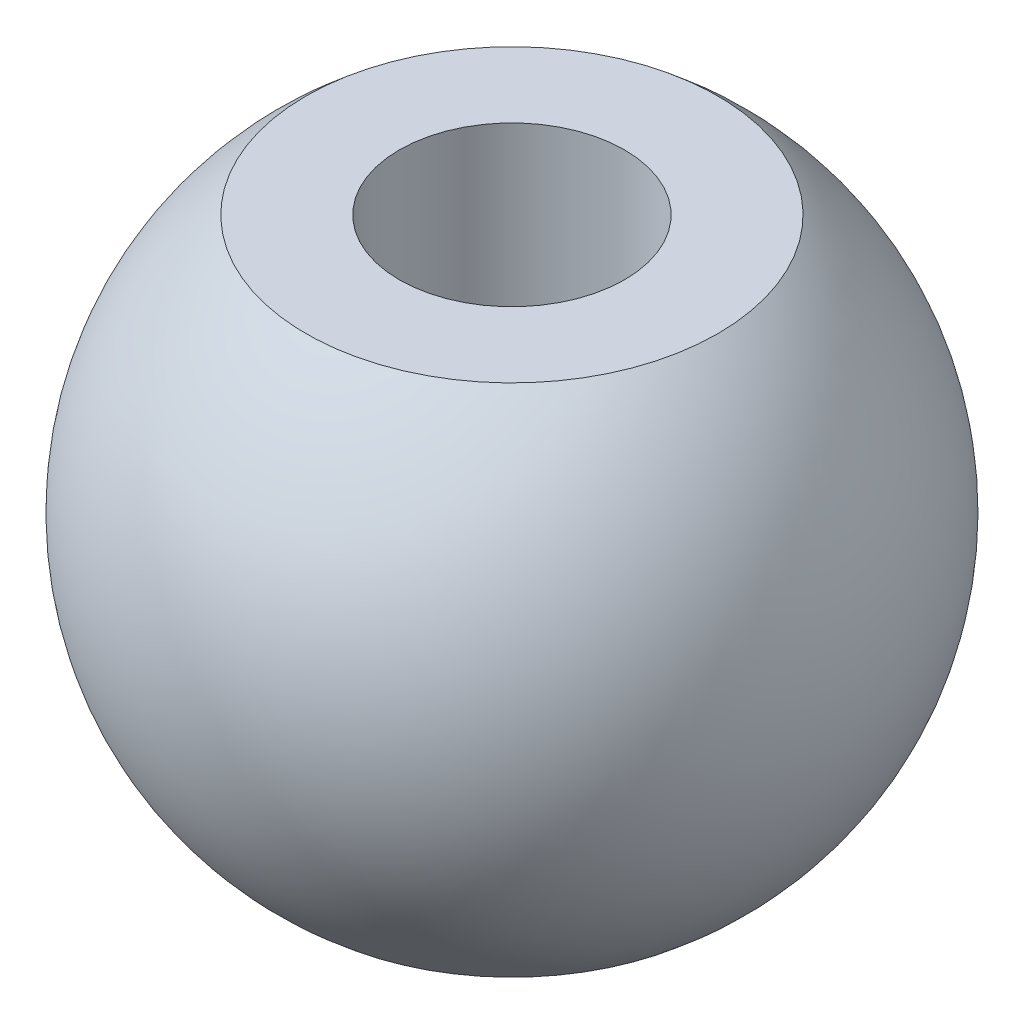
ISO-10303-21;
HEADER;
FILE_DESCRIPTION(('STEP AP214'),'2;1');
FILE_NAME('part.step','',(''),(''),'','','');
FILE_SCHEMA(('AUTOMOTIVE_DESIGN { 1 0 10303 214 1 1 1 1 }'));
ENDSEC;
DATA;
#1=APPLICATION_CONTEXT('core data for automotive mechanical design processes');
#2=APPLICATION_PROTOCOL_DEFINITION('international standard','automotive_design',2000,#1);
#3=PRODUCT_CONTEXT('',#1,'mechanical');
#4=PRODUCT('Part','Part','',(#3));
#5=PRODUCT_RELATED_PRODUCT_CATEGORY('part','',(#4));
#6=PRODUCT_DEFINITION_FORMATION('','',#4);
#7=PRODUCT_DEFINITION_CONTEXT('part definition',#1,'design');
#8=PRODUCT_DEFINITION('design','',#6,#7);
#9=PRODUCT_DEFINITION_SHAPE('','',#8);
#10=(LENGTH_UNIT() NAMED_UNIT(*) SI_UNIT(.MILLI.,.METRE.));
#11=(NAMED_UNIT(*) PLANE_ANGLE_UNIT() SI_UNIT($,.RADIAN.));
#12=(NAMED_UNIT(*) SI_UNIT($,.STERADIAN.) SOLID_ANGLE_UNIT());
#13=UNCERTAINTY_MEASURE_WITH_UNIT(LENGTH_MEASURE(1.E-05),#10,'distance_accuracy_value','');
#14=(GEOMETRIC_REPRESENTATION_CONTEXT(3) GLOBAL_UNCERTAINTY_ASSIGNED_CONTEXT((#13)) GLOBAL_UNIT_ASSIGNED_CONTEXT((#10,
#11,#12)) REPRESENTATION_CONTEXT('',''));
#15=CARTESIAN_POINT('',(0.,0.,0.));
#16=DIRECTION('',(0.,0.,1.));
#17=DIRECTION('',(1.,0.,0.));
#18=AXIS2_PLACEMENT_3D('',#15,#16,#17);
#19=CARTESIAN_POINT('',(0.,4.,0.));
#20=DIRECTION('',(0.,1.,0.));
#21=DIRECTION('',(0.,0.,1.));
#22=AXIS2_PLACEMENT_3D('',#19,#20,#21);
#23=PLANE('',#22);
#24=CARTESIAN_POINT('',(0.,4.,0.));
#25=DIRECTION('',(0.,1.,0.));
#26=DIRECTION('',(0.,0.,1.));
#27=AXIS2_PLACEMENT_3D('',#24,#25,#26);
#28=CIRCLE('',#27,1.75);
#29=CARTESIAN_POINT('',(0.,4.,1.75));
#30=VERTEX_POINT('',#29);
#31=EDGE_CURVE('E51',#30,#30,#28,.T.);
#32=ORIENTED_EDGE('',*,*,#31,.F.);
#33=EDGE_LOOP('',(#32));
#34=FACE_BOUND('',#33,.T.);
#35=CARTESIAN_POINT('',(0.,4.,0.));
#36=DIRECTION('',(0.,1.,0.));
#37=DIRECTION('',(0.,0.,1.));
#38=AXIS2_PLACEMENT_3D('',#35,#36,#37);
#39=CIRCLE('',#38,3.2);
#40=CARTESIAN_POINT('',(-3.2,4.,0.));
#41=VERTEX_POINT('',#40);
#42=EDGE_CURVE('E10',#41,#41,#39,.T.);
#43=ORIENTED_EDGE('',*,*,#42,.T.);
#44=EDGE_LOOP('',(#43));
#45=FACE_BOUND('',#44,.T.);
#46=ADVANCED_FACE('F40',(#34,#45),#23,.T.);
#47=CARTESIAN_POINT('',(0.,0.,0.));
#48=DIRECTION('',(0.,1.,0.));
#49=DIRECTION('',(-1.,0.,0.));
#50=AXIS2_PLACEMENT_3D('',#47,#48,#49);
#51=SPHERICAL_SURFACE('',#50,5.12249938994628);
#52=CARTESIAN_POINT('',(0.,-4.,0.));
#53=DIRECTION('',(0.,1.,0.));
#54=DIRECTION('',(0.,0.,1.));
#55=AXIS2_PLACEMENT_3D('',#52,#53,#54);
#56=CIRCLE('',#55,3.2);
#57=CARTESIAN_POINT('',(-3.2,-4.,0.));
#58=VERTEX_POINT('',#57);
#59=EDGE_CURVE('E43',#58,#58,#56,.T.);
#60=CARTESIAN_POINT('',(-3.2,-4.,0.));
#61=CARTESIAN_POINT('',(-3.274673290891,-3.94026522354734,0.));
#62=CARTESIAN_POINT('',(-3.3476699179412,-3.87843508535872,0.));
#63=CARTESIAN_POINT('',(-3.49008979523146,-3.75078781772341,0.));
#64=CARTESIAN_POINT('',(-3.55951304547154,-3.68497068827673,0.));
#65=CARTESIAN_POINT('',(-3.69456612001304,-3.54955317033917,0.));
#66=CARTESIAN_POINT('',(-3.76019594431448,-3.47995278184829,0.));
#67=CARTESIAN_POINT('',(-3.8874570146498,-3.33718769046449,0.));
#68=CARTESIAN_POINT('',(-3.94908826068369,-3.26402298757157,0.));
#69=CARTESIAN_POINT('',(-4.06815875551761,-3.11435849061012,0.));
#70=CARTESIAN_POINT('',(-4.12559800431764,-3.0378586965416,0.));
#71=CARTESIAN_POINT('',(-4.23610444556227,-2.88176393836279,0.));
#72=CARTESIAN_POINT('',(-4.28917163800686,-2.80216897425251,0.));
#73=CARTESIAN_POINT('',(-4.39076755854222,-2.640133437798,0.));
#74=CARTESIAN_POINT('',(-4.43929628663298,-2.55769286545376,0.));
#75=CARTESIAN_POINT('',(-4.53166311660203,-2.39022461420465,0.));
#76=CARTESIAN_POINT('',(-4.57550121848031,-2.30519693529978,0.));
#77=CARTESIAN_POINT('',(-4.65834933779664,-2.13282108002461,0.));
#78=CARTESIAN_POINT('',(-4.6973593552347,-2.04547290365432,0.));
#79=CARTESIAN_POINT('',(-4.77042898734124,-1.86872993986098,0.));
#80=CARTESIAN_POINT('',(-4.80448860200973,-1.77933515243794,0.));
#81=CARTESIAN_POINT('',(-4.86755063227483,-1.59877926990779,0.));
#82=CARTESIAN_POINT('',(-4.89655304787144,-1.50761817480069,0.));
#83=CARTESIAN_POINT('',(-4.94940974096204,-1.32381551873807,0.));
#84=CARTESIAN_POINT('',(-4.97326401845603,-1.23117395778255,0.));
#85=CARTESIAN_POINT('',(-5.01574963862662,-1.04470085393628,0.));
#86=CARTESIAN_POINT('',(-5.03438098130322,-0.950869311045537,0.));
#87=CARTESIAN_POINT('',(-5.06636231199748,-0.762310458517741,0.));
#88=CARTESIAN_POINT('',(-5.07971230001515,-0.667583148880689,0.));
#89=CARTESIAN_POINT('',(-5.10108906159539,-0.47752978678507,0.));
#90=CARTESIAN_POINT('',(-5.10911583515796,-0.382203734326502,0.));
#91=CARTESIAN_POINT('',(-5.11982099933341,-0.191251787911956,0.));
#92=CARTESIAN_POINT('',(-5.12249938994628,-0.0956258939559785,0.));
#93=CARTESIAN_POINT('',(-5.12249938994628,0.0956258939559774,0.));
#94=CARTESIAN_POINT('',(-5.11982099933341,0.191251787911955,0.));
#95=CARTESIAN_POINT('',(-5.10911583515796,0.382203734326501,0.));
#96=CARTESIAN_POINT('',(-5.10108906159539,0.477529786785069,0.));
#97=CARTESIAN_POINT('',(-5.07971230001515,0.667583148880688,0.));
#98=CARTESIAN_POINT('',(-5.06636231199748,0.762310458517739,0.));
#99=CARTESIAN_POINT('',(-5.03438098130322,0.950869311045536,0.));
#100=CARTESIAN_POINT('',(-5.01574963862662,1.04470085393628,0.));
#101=CARTESIAN_POINT('',(-4.97326401845603,1.23117395778254,0.));
#102=CARTESIAN_POINT('',(-4.94940974096204,1.32381551873807,0.));
#103=CARTESIAN_POINT('',(-4.89655304787144,1.50761817480069,0.));
#104=CARTESIAN_POINT('',(-4.86755063227483,1.59877926990779,0.));
#105=CARTESIAN_POINT('',(-4.80448860200973,1.77933515243794,0.));
#106=CARTESIAN_POINT('',(-4.77042898734124,1.86872993986098,0.));
#107=CARTESIAN_POINT('',(-4.6973593552347,2.04547290365432,0.));
#108=CARTESIAN_POINT('',(-4.65834933779664,2.13282108002461,0.));
#109=CARTESIAN_POINT('',(-4.57550121848031,2.30519693529978,0.));
#110=CARTESIAN_POINT('',(-4.53166311660203,2.39022461420465,0.));
#111=CARTESIAN_POINT('',(-4.43929628663299,2.55769286545376,0.));
#112=CARTESIAN_POINT('',(-4.39076755854222,2.640133437798,0.));
#113=CARTESIAN_POINT('',(-4.28917163800686,2.80216897425251,0.));
#114=CARTESIAN_POINT('',(-4.23610444556227,2.88176393836279,0.));
#115=CARTESIAN_POINT('',(-4.12559800431764,3.03785869654159,0.));
#116=CARTESIAN_POINT('',(-4.06815875551761,3.11435849061012,0.));
#117=CARTESIAN_POINT('',(-3.94908826068369,3.26402298757157,0.));
#118=CARTESIAN_POINT('',(-3.8874570146498,3.33718769046449,0.));
#119=CARTESIAN_POINT('',(-3.76019594431448,3.47995278184829,0.));
#120=CARTESIAN_POINT('',(-3.69456612001304,3.54955317033917,0.));
#121=CARTESIAN_POINT('',(-3.55951304547154,3.68497068827673,0.));
#122=CARTESIAN_POINT('',(-3.49008979523146,3.75078781772341,0.));
#123=CARTESIAN_POINT('',(-3.3476699179412,3.87843508535872,0.));
#124=CARTESIAN_POINT('',(-3.274673290891,3.94026522354734,0.));
#125=CARTESIAN_POINT('',(-3.2,4.,0.));
#126=B_SPLINE_CURVE_WITH_KNOTS('',3,(#60,#61,#62,#63,#64,#65,#66,#67,#68,#69,#70,#71,#72,#73,
#74,#75,#76,#77,#78,#79,#80,#81,#82,#83,#84,#85,#86,#87,#88,#89,#90,#91,#92,#93,#94,#95,#96,#97,
#98,#99,#100,#101,#102,#103,#104,#105,#106,#107,#108,#109,#110,#111,#112,#113,#114,#115,#116,
#117,#118,#119,#120,#121,#122,#123,#124,#125),.UNSPECIFIED.,.F.,.F.,(4,2,2,2,2,2,2,2,2,2,2,2,2,
2,2,2,2,2,2,2,2,2,2,2,2,2,2,2,2,2,2,2,4),(0.,0.286840209034513,0.573680418069026,
0.860520627103539,1.14736083613805,1.43420104517257,1.72104125420708,2.00788146324159,
2.29472167227611,2.58156188131062,2.86840209034513,3.15524229937964,3.44208250841416,
3.72892271744867,4.01576292648318,4.3026031355177,4.58944334455221,4.87628355358672,
5.16312376262124,5.44996397165575,5.73680418069026,6.02364438972478,6.31048459875929,
6.5973248077938,6.88416501682832,7.17100522586283,7.45784543489734,7.74468564393185,
8.03152585296637,8.31836606200088,8.60520627103539,8.89204648006991,9.17888668910442),.UNSPECIFIED.);
#127=EDGE_CURVE('BSEAM58',#58,#41,#126,.T.);
#128=ORIENTED_EDGE('',*,*,#59,.T.);
#129=ORIENTED_EDGE('',*,*,#42,.F.);
#130=ORIENTED_EDGE('',*,*,#127,.T.);
#131=ORIENTED_EDGE('',*,*,#127,.F.);
#132=EDGE_LOOP('',(#128,#130,#129,#131));
#133=FACE_BOUND('',#132,.T.);
#134=ADVANCED_FACE('F58',(#133),#51,.T.);
#135=CARTESIAN_POINT('',(0.,-4.,0.));
#136=DIRECTION('',(0.,-1.,0.));
#137=DIRECTION('',(0.,0.,-1.));
#138=AXIS2_PLACEMENT_3D('',#135,#136,#137);
#139=PLANE('',#138);
#140=CARTESIAN_POINT('',(0.,-4.,0.));
#141=DIRECTION('',(0.,1.,0.));
#142=DIRECTION('',(0.,0.,1.));
#143=AXIS2_PLACEMENT_3D('',#140,#141,#142);
#144=CIRCLE('',#143,1.75);
#145=CARTESIAN_POINT('',(0.,-4.,1.75));
#146=VERTEX_POINT('',#145);
#147=EDGE_CURVE('E50',#146,#146,#144,.T.);
#148=ORIENTED_EDGE('',*,*,#147,.T.);
#149=EDGE_LOOP('',(#148));
#150=FACE_BOUND('',#149,.T.);
#151=ORIENTED_EDGE('',*,*,#59,.F.);
#152=EDGE_LOOP('',(#151));
#153=FACE_BOUND('',#152,.T.);
#154=ADVANCED_FACE('F62',(#150,#153),#139,.T.);
#155=CARTESIAN_POINT('',(0.,-4.,0.));
#156=DIRECTION('',(0.,1.,0.));
#157=DIRECTION('',(0.,0.,1.));
#158=AXIS2_PLACEMENT_3D('',#155,#156,#157);
#159=CYLINDRICAL_SURFACE('',#158,1.75);
#160=ORIENTED_EDGE('',*,*,#147,.F.);
#161=EDGE_LOOP('',(#160));
#162=FACE_BOUND('',#161,.T.);
#163=ORIENTED_EDGE('',*,*,#31,.T.);
#164=EDGE_LOOP('',(#163));
#165=FACE_BOUND('',#164,.T.);
#166=ADVANCED_FACE('F60',(#162,#165),#159,.F.);
#167=CLOSED_SHELL('',(#46,#134,#154,#166));
#168=MANIFOLD_SOLID_BREP('B2',#167);
#169=ADVANCED_BREP_SHAPE_REPRESENTATION('',(#18,#168),#14);
#170=SHAPE_DEFINITION_REPRESENTATION(#9,#169);
ENDSEC;
END-ISO-10303-21;
